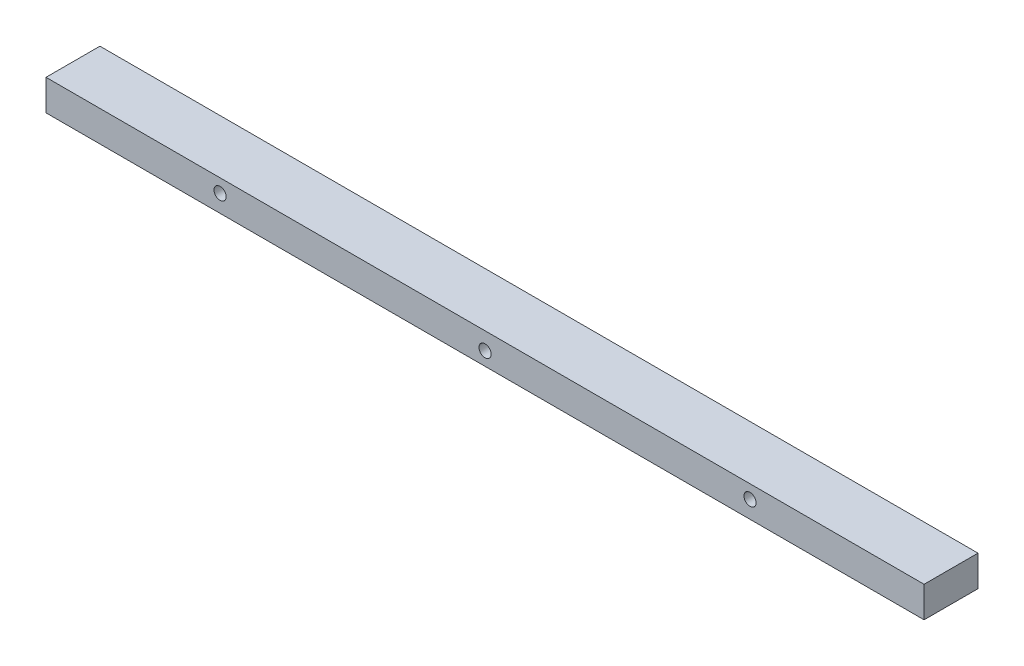
ISO-10303-21;
HEADER;
FILE_DESCRIPTION(('STEP AP214'),'2;1');
FILE_NAME('part.step','',(''),(''),'','','');
FILE_SCHEMA(('AUTOMOTIVE_DESIGN { 1 0 10303 214 1 1 1 1 }'));
ENDSEC;
DATA;
#1=APPLICATION_CONTEXT('core data for automotive mechanical design processes');
#2=APPLICATION_PROTOCOL_DEFINITION('international standard','automotive_design',2000,#1);
#3=PRODUCT_CONTEXT('',#1,'mechanical');
#4=PRODUCT('Part','Part','',(#3));
#5=PRODUCT_RELATED_PRODUCT_CATEGORY('part','',(#4));
#6=PRODUCT_DEFINITION_FORMATION('','',#4);
#7=PRODUCT_DEFINITION_CONTEXT('part definition',#1,'design');
#8=PRODUCT_DEFINITION('design','',#6,#7);
#9=PRODUCT_DEFINITION_SHAPE('','',#8);
#10=(LENGTH_UNIT() NAMED_UNIT(*) SI_UNIT(.MILLI.,.METRE.));
#11=(NAMED_UNIT(*) PLANE_ANGLE_UNIT() SI_UNIT($,.RADIAN.));
#12=(NAMED_UNIT(*) SI_UNIT($,.STERADIAN.) SOLID_ANGLE_UNIT());
#13=UNCERTAINTY_MEASURE_WITH_UNIT(LENGTH_MEASURE(1.E-05),#10,'distance_accuracy_value','');
#14=(GEOMETRIC_REPRESENTATION_CONTEXT(3) GLOBAL_UNCERTAINTY_ASSIGNED_CONTEXT((#13)) GLOBAL_UNIT_ASSIGNED_CONTEXT((#10,
#11,#12)) REPRESENTATION_CONTEXT('',''));
#15=CARTESIAN_POINT('',(0.,0.,0.));
#16=DIRECTION('',(0.,0.,1.));
#17=DIRECTION('',(1.,0.,0.));
#18=AXIS2_PLACEMENT_3D('',#15,#16,#17);
#19=CARTESIAN_POINT('',(0.,0.,22.225));
#20=DIRECTION('',(0.,0.,-1.));
#21=DIRECTION('',(-1.,0.,0.));
#22=AXIS2_PLACEMENT_3D('',#19,#20,#21);
#23=PLANE('',#22);
#24=DIRECTION('',(0.,-1.,0.));
#25=VECTOR('',#24,1.);
#26=CARTESIAN_POINT('',(0.,0.,22.225));
#27=LINE('',#26,#25);
#28=CARTESIAN_POINT('',(0.,12.7,22.225));
#29=VERTEX_POINT('',#28);
#30=CARTESIAN_POINT('',(0.,0.,22.225));
#31=VERTEX_POINT('',#30);
#32=EDGE_CURVE('E85',#29,#31,#27,.T.);
#33=ORIENTED_EDGE('',*,*,#32,.T.);
#34=DIRECTION('',(1.,0.,0.));
#35=VECTOR('',#34,1.);
#36=CARTESIAN_POINT('',(0.,0.,22.225));
#37=LINE('',#36,#35);
#38=CARTESIAN_POINT('',(361.95,0.,22.225));
#39=VERTEX_POINT('',#38);
#40=EDGE_CURVE('E80',#31,#39,#37,.T.);
#41=ORIENTED_EDGE('',*,*,#40,.T.);
#42=DIRECTION('',(0.,1.,0.));
#43=VECTOR('',#42,1.);
#44=CARTESIAN_POINT('',(361.95,0.,22.225));
#45=LINE('',#44,#43);
#46=CARTESIAN_POINT('',(361.95,12.7,22.225));
#47=VERTEX_POINT('',#46);
#48=EDGE_CURVE('E83',#39,#47,#45,.T.);
#49=ORIENTED_EDGE('',*,*,#48,.T.);
#50=DIRECTION('',(-1.,0.,0.));
#51=VECTOR('',#50,1.);
#52=CARTESIAN_POINT('',(0.,12.7,22.225));
#53=LINE('',#52,#51);
#54=EDGE_CURVE('E50',#47,#29,#53,.T.);
#55=ORIENTED_EDGE('',*,*,#54,.T.);
#56=EDGE_LOOP('',(#33,#41,#49,#55));
#57=FACE_BOUND('',#56,.T.);
#58=CARTESIAN_POINT('',(180.975,5.55625,22.225));
#59=DIRECTION('',(0.,0.,1.));
#60=DIRECTION('',(1.,0.,0.));
#61=AXIS2_PLACEMENT_3D('',#58,#59,#60);
#62=CIRCLE('',#61,2.5);
#63=CARTESIAN_POINT('',(183.475,5.55625,22.225));
#64=VERTEX_POINT('',#63);
#65=EDGE_CURVE('E100',#64,#64,#62,.T.);
#66=ORIENTED_EDGE('',*,*,#65,.F.);
#67=EDGE_LOOP('',(#66));
#68=FACE_BOUND('',#67,.T.);
#69=CARTESIAN_POINT('',(71.755,7.14375,22.225));
#70=DIRECTION('',(0.,0.,1.));
#71=DIRECTION('',(1.,0.,0.));
#72=AXIS2_PLACEMENT_3D('',#69,#70,#71);
#73=CIRCLE('',#72,2.49999999999999);
#74=CARTESIAN_POINT('',(74.255,7.14375,22.225));
#75=VERTEX_POINT('',#74);
#76=EDGE_CURVE('E115',#75,#75,#73,.T.);
#77=ORIENTED_EDGE('',*,*,#76,.F.);
#78=EDGE_LOOP('',(#77));
#79=FACE_BOUND('',#78,.T.);
#80=CARTESIAN_POINT('',(290.195,7.14375000000004,22.225));
#81=DIRECTION('',(0.,0.,1.));
#82=DIRECTION('',(1.,0.,0.));
#83=AXIS2_PLACEMENT_3D('',#80,#81,#82);
#84=CIRCLE('',#83,2.49999999999996);
#85=CARTESIAN_POINT('',(292.695,7.14375000000004,22.225));
#86=VERTEX_POINT('',#85);
#87=EDGE_CURVE('E121',#86,#86,#84,.T.);
#88=ORIENTED_EDGE('',*,*,#87,.F.);
#89=EDGE_LOOP('',(#88));
#90=FACE_BOUND('',#89,.T.);
#91=ADVANCED_FACE('F33',(#57,#68,#79,#90),#23,.F.);
#92=CARTESIAN_POINT('',(0.,0.,0.));
#93=DIRECTION('',(0.,0.,-1.));
#94=DIRECTION('',(-1.,0.,0.));
#95=AXIS2_PLACEMENT_3D('',#92,#93,#94);
#96=PLANE('',#95);
#97=CARTESIAN_POINT('',(71.755,7.14375,0.));
#98=DIRECTION('',(0.,0.,1.));
#99=DIRECTION('',(1.,0.,0.));
#100=AXIS2_PLACEMENT_3D('',#97,#98,#99);
#101=CIRCLE('',#100,2.49999999999999);
#102=CARTESIAN_POINT('',(74.255,7.14375,0.));
#103=VERTEX_POINT('',#102);
#104=EDGE_CURVE('E118',#103,#103,#101,.T.);
#105=ORIENTED_EDGE('',*,*,#104,.T.);
#106=EDGE_LOOP('',(#105));
#107=FACE_BOUND('',#106,.T.);
#108=DIRECTION('',(0.,-1.,0.));
#109=VECTOR('',#108,1.);
#110=CARTESIAN_POINT('',(0.,0.,0.));
#111=LINE('',#110,#109);
#112=CARTESIAN_POINT('',(0.,12.7,0.));
#113=VERTEX_POINT('',#112);
#114=CARTESIAN_POINT('',(0.,0.,0.));
#115=VERTEX_POINT('',#114);
#116=EDGE_CURVE('E97',#113,#115,#111,.T.);
#117=ORIENTED_EDGE('',*,*,#116,.F.);
#118=DIRECTION('',(-1.,0.,0.));
#119=VECTOR('',#118,1.);
#120=CARTESIAN_POINT('',(0.,12.7,0.));
#121=LINE('',#120,#119);
#122=CARTESIAN_POINT('',(361.95,12.7,0.));
#123=VERTEX_POINT('',#122);
#124=EDGE_CURVE('E73',#123,#113,#121,.T.);
#125=ORIENTED_EDGE('',*,*,#124,.F.);
#126=DIRECTION('',(0.,1.,0.));
#127=VECTOR('',#126,1.);
#128=CARTESIAN_POINT('',(361.95,0.,0.));
#129=LINE('',#128,#127);
#130=CARTESIAN_POINT('',(361.95,0.,0.));
#131=VERTEX_POINT('',#130);
#132=EDGE_CURVE('E67',#131,#123,#129,.T.);
#133=ORIENTED_EDGE('',*,*,#132,.F.);
#134=DIRECTION('',(1.,0.,0.));
#135=VECTOR('',#134,1.);
#136=CARTESIAN_POINT('',(0.,0.,0.));
#137=LINE('',#136,#135);
#138=EDGE_CURVE('E89',#115,#131,#137,.T.);
#139=ORIENTED_EDGE('',*,*,#138,.F.);
#140=EDGE_LOOP('',(#117,#125,#133,#139));
#141=FACE_BOUND('',#140,.T.);
#142=CARTESIAN_POINT('',(180.975,5.55625,0.));
#143=DIRECTION('',(0.,0.,1.));
#144=DIRECTION('',(1.,0.,0.));
#145=AXIS2_PLACEMENT_3D('',#142,#143,#144);
#146=CIRCLE('',#145,2.5);
#147=CARTESIAN_POINT('',(183.475,5.55625,0.));
#148=VERTEX_POINT('',#147);
#149=EDGE_CURVE('E112',#148,#148,#146,.T.);
#150=ORIENTED_EDGE('',*,*,#149,.T.);
#151=EDGE_LOOP('',(#150));
#152=FACE_BOUND('',#151,.T.);
#153=CARTESIAN_POINT('',(290.195,7.14375000000004,0.));
#154=DIRECTION('',(0.,0.,1.));
#155=DIRECTION('',(1.,0.,0.));
#156=AXIS2_PLACEMENT_3D('',#153,#154,#155);
#157=CIRCLE('',#156,2.49999999999996);
#158=CARTESIAN_POINT('',(292.695,7.14375000000004,0.));
#159=VERTEX_POINT('',#158);
#160=EDGE_CURVE('E124',#159,#159,#157,.T.);
#161=ORIENTED_EDGE('',*,*,#160,.T.);
#162=EDGE_LOOP('',(#161));
#163=FACE_BOUND('',#162,.T.);
#164=ADVANCED_FACE('F108',(#107,#141,#152,#163),#96,.T.);
#165=CARTESIAN_POINT('',(0.,0.,22.225));
#166=DIRECTION('',(1.,0.,0.));
#167=DIRECTION('',(0.,0.,-1.));
#168=AXIS2_PLACEMENT_3D('',#165,#166,#167);
#169=PLANE('',#168);
#170=ORIENTED_EDGE('',*,*,#116,.T.);
#171=DIRECTION('',(0.,0.,-1.));
#172=VECTOR('',#171,1.);
#173=CARTESIAN_POINT('',(0.,0.,22.225));
#174=LINE('',#173,#172);
#175=EDGE_CURVE('E11',#31,#115,#174,.T.);
#176=ORIENTED_EDGE('',*,*,#175,.F.);
#177=ORIENTED_EDGE('',*,*,#32,.F.);
#178=DIRECTION('',(0.,0.,-1.));
#179=VECTOR('',#178,1.);
#180=CARTESIAN_POINT('',(0.,12.7,22.225));
#181=LINE('',#180,#179);
#182=EDGE_CURVE('E93',#29,#113,#181,.T.);
#183=ORIENTED_EDGE('',*,*,#182,.T.);
#184=EDGE_LOOP('',(#170,#176,#177,#183));
#185=FACE_BOUND('',#184,.T.);
#186=ADVANCED_FACE('F35',(#185),#169,.F.);
#187=CARTESIAN_POINT('',(0.,0.,22.225));
#188=DIRECTION('',(0.,1.,0.));
#189=DIRECTION('',(0.,0.,1.));
#190=AXIS2_PLACEMENT_3D('',#187,#188,#189);
#191=PLANE('',#190);
#192=ORIENTED_EDGE('',*,*,#138,.T.);
#193=DIRECTION('',(0.,0.,-1.));
#194=VECTOR('',#193,1.);
#195=CARTESIAN_POINT('',(361.95,0.,22.225));
#196=LINE('',#195,#194);
#197=EDGE_CURVE('E42',#39,#131,#196,.T.);
#198=ORIENTED_EDGE('',*,*,#197,.F.);
#199=ORIENTED_EDGE('',*,*,#40,.F.);
#200=ORIENTED_EDGE('',*,*,#175,.T.);
#201=EDGE_LOOP('',(#192,#198,#199,#200));
#202=FACE_BOUND('',#201,.T.);
#203=ADVANCED_FACE('F88',(#202),#191,.F.);
#204=CARTESIAN_POINT('',(361.95,0.,22.225));
#205=DIRECTION('',(-1.,0.,0.));
#206=DIRECTION('',(0.,0.,1.));
#207=AXIS2_PLACEMENT_3D('',#204,#205,#206);
#208=PLANE('',#207);
#209=ORIENTED_EDGE('',*,*,#132,.T.);
#210=DIRECTION('',(0.,0.,-1.));
#211=VECTOR('',#210,1.);
#212=CARTESIAN_POINT('',(361.95,12.7,22.225));
#213=LINE('',#212,#211);
#214=EDGE_CURVE('E90',#47,#123,#213,.T.);
#215=ORIENTED_EDGE('',*,*,#214,.F.);
#216=ORIENTED_EDGE('',*,*,#48,.F.);
#217=ORIENTED_EDGE('',*,*,#197,.T.);
#218=EDGE_LOOP('',(#209,#215,#216,#217));
#219=FACE_BOUND('',#218,.T.);
#220=ADVANCED_FACE('F91',(#219),#208,.F.);
#221=CARTESIAN_POINT('',(0.,12.7,22.225));
#222=DIRECTION('',(0.,-1.,0.));
#223=DIRECTION('',(0.,0.,-1.));
#224=AXIS2_PLACEMENT_3D('',#221,#222,#223);
#225=PLANE('',#224);
#226=ORIENTED_EDGE('',*,*,#124,.T.);
#227=ORIENTED_EDGE('',*,*,#182,.F.);
#228=ORIENTED_EDGE('',*,*,#54,.F.);
#229=ORIENTED_EDGE('',*,*,#214,.T.);
#230=EDGE_LOOP('',(#226,#227,#228,#229));
#231=FACE_BOUND('',#230,.T.);
#232=ADVANCED_FACE('F105',(#231),#225,.F.);
#233=CARTESIAN_POINT('',(180.975,5.55625,22.225));
#234=DIRECTION('',(0.,0.,-1.));
#235=DIRECTION('',(-1.,0.,0.));
#236=AXIS2_PLACEMENT_3D('',#233,#234,#235);
#237=CYLINDRICAL_SURFACE('',#236,2.5);
#238=ORIENTED_EDGE('',*,*,#65,.T.);
#239=EDGE_LOOP('',(#238));
#240=FACE_BOUND('',#239,.T.);
#241=ORIENTED_EDGE('',*,*,#149,.F.);
#242=EDGE_LOOP('',(#241));
#243=FACE_BOUND('',#242,.T.);
#244=ADVANCED_FACE('F141',(#240,#243),#237,.F.);
#245=CARTESIAN_POINT('',(71.755,7.14375,22.225));
#246=DIRECTION('',(0.,0.,-1.));
#247=DIRECTION('',(-1.,0.,0.));
#248=AXIS2_PLACEMENT_3D('',#245,#246,#247);
#249=CYLINDRICAL_SURFACE('',#248,2.49999999999999);
#250=ORIENTED_EDGE('',*,*,#76,.T.);
#251=EDGE_LOOP('',(#250));
#252=FACE_BOUND('',#251,.T.);
#253=ORIENTED_EDGE('',*,*,#104,.F.);
#254=EDGE_LOOP('',(#253));
#255=FACE_BOUND('',#254,.T.);
#256=ADVANCED_FACE('F187',(#252,#255),#249,.F.);
#257=CARTESIAN_POINT('',(290.195,7.14375000000004,22.225));
#258=DIRECTION('',(0.,0.,-1.));
#259=DIRECTION('',(-1.,0.,0.));
#260=AXIS2_PLACEMENT_3D('',#257,#258,#259);
#261=CYLINDRICAL_SURFACE('',#260,2.49999999999996);
#262=ORIENTED_EDGE('',*,*,#87,.T.);
#263=EDGE_LOOP('',(#262));
#264=FACE_BOUND('',#263,.T.);
#265=ORIENTED_EDGE('',*,*,#160,.F.);
#266=EDGE_LOOP('',(#265));
#267=FACE_BOUND('',#266,.T.);
#268=ADVANCED_FACE('F130',(#264,#267),#261,.F.);
#269=CLOSED_SHELL('',(#91,#164,#186,#203,#220,#232,#244,#256,#268));
#270=MANIFOLD_SOLID_BREP('B2',#269);
#271=ADVANCED_BREP_SHAPE_REPRESENTATION('',(#18,#270),#14);
#272=SHAPE_DEFINITION_REPRESENTATION(#9,#271);
ENDSEC;
END-ISO-10303-21;
